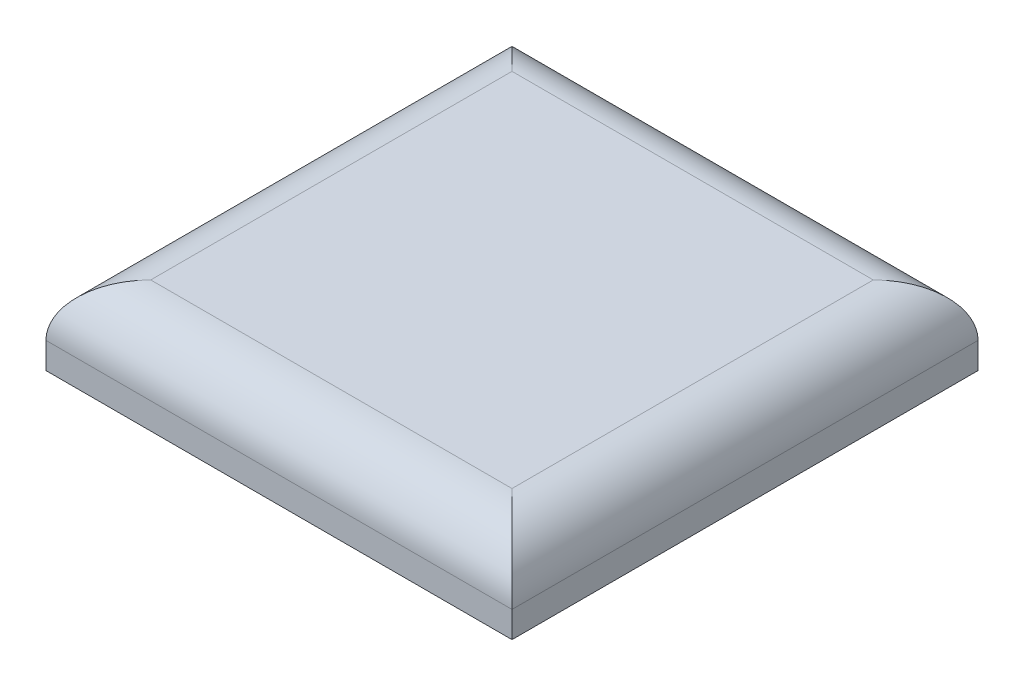
ISO-10303-21;
HEADER;
FILE_DESCRIPTION(('STEP AP214'),'2;1');
FILE_NAME('part.step','',(''),(''),'','','');
FILE_SCHEMA(('AUTOMOTIVE_DESIGN { 1 0 10303 214 1 1 1 1 }'));
ENDSEC;
DATA;
#1=APPLICATION_CONTEXT('core data for automotive mechanical design processes');
#2=APPLICATION_PROTOCOL_DEFINITION('international standard','automotive_design',2000,#1);
#3=PRODUCT_CONTEXT('',#1,'mechanical');
#4=PRODUCT('Part','Part','',(#3));
#5=PRODUCT_RELATED_PRODUCT_CATEGORY('part','',(#4));
#6=PRODUCT_DEFINITION_FORMATION('','',#4);
#7=PRODUCT_DEFINITION_CONTEXT('part definition',#1,'design');
#8=PRODUCT_DEFINITION('design','',#6,#7);
#9=PRODUCT_DEFINITION_SHAPE('','',#8);
#10=(LENGTH_UNIT() NAMED_UNIT(*) SI_UNIT(.MILLI.,.METRE.));
#11=(NAMED_UNIT(*) PLANE_ANGLE_UNIT() SI_UNIT($,.RADIAN.));
#12=(NAMED_UNIT(*) SI_UNIT($,.STERADIAN.) SOLID_ANGLE_UNIT());
#13=UNCERTAINTY_MEASURE_WITH_UNIT(LENGTH_MEASURE(1.E-05),#10,'distance_accuracy_value','');
#14=(GEOMETRIC_REPRESENTATION_CONTEXT(3) GLOBAL_UNCERTAINTY_ASSIGNED_CONTEXT((#13)) GLOBAL_UNIT_ASSIGNED_CONTEXT((#10,
#11,#12)) REPRESENTATION_CONTEXT('',''));
#15=CARTESIAN_POINT('',(0.,0.,0.));
#16=DIRECTION('',(0.,0.,1.));
#17=DIRECTION('',(1.,0.,0.));
#18=AXIS2_PLACEMENT_3D('',#15,#16,#17);
#19=CARTESIAN_POINT('',(0.,1.,-6.9));
#20=DIRECTION('',(-1.,0.,0.));
#21=DIRECTION('',(0.,0.,1.));
#22=AXIS2_PLACEMENT_3D('',#19,#20,#21);
#23=CYLINDRICAL_SURFACE('',#22,2.);
#24=CARTESIAN_POINT('',(-6.9,1.,-6.9));
#25=DIRECTION('',(-0.707106781186547,0.,0.707106781186547));
#26=DIRECTION('',(0.707106781186547,0.,0.707106781186547));
#27=AXIS2_PLACEMENT_3D('',#24,#25,#26);
#28=ELLIPSE('',#27,2.82842712474619,2.);
#29=CARTESIAN_POINT('',(-6.9,3.,-6.9));
#30=VERTEX_POINT('',#29);
#31=CARTESIAN_POINT('',(-8.9,1.,-8.9));
#32=VERTEX_POINT('',#31);
#33=EDGE_CURVE('E11',#30,#32,#28,.T.);
#34=ORIENTED_EDGE('',*,*,#33,.F.);
#35=DIRECTION('',(-1.,0.,0.));
#36=VECTOR('',#35,1.);
#37=CARTESIAN_POINT('',(0.,3.,-6.9));
#38=LINE('',#37,#36);
#39=CARTESIAN_POINT('',(6.9,3.,-6.9));
#40=VERTEX_POINT('',#39);
#41=EDGE_CURVE('E96',#40,#30,#38,.T.);
#42=ORIENTED_EDGE('',*,*,#41,.F.);
#43=CARTESIAN_POINT('',(6.9,1.,-6.9));
#44=DIRECTION('',(-0.707106781186547,0.,-0.707106781186547));
#45=DIRECTION('',(-0.707106781186547,0.,0.707106781186547));
#46=AXIS2_PLACEMENT_3D('',#43,#44,#45);
#47=ELLIPSE('',#46,2.82842712474619,2.);
#48=CARTESIAN_POINT('',(8.9,1.,-8.9));
#49=VERTEX_POINT('',#48);
#50=EDGE_CURVE('E42',#40,#49,#47,.T.);
#51=ORIENTED_EDGE('',*,*,#50,.T.);
#52=DIRECTION('',(-1.,0.,0.));
#53=VECTOR('',#52,1.);
#54=CARTESIAN_POINT('',(-8.9,1.,-8.9));
#55=LINE('',#54,#53);
#56=EDGE_CURVE('E93',#32,#49,#55,.F.);
#57=ORIENTED_EDGE('',*,*,#56,.F.);
#58=EDGE_LOOP('',(#34,#42,#51,#57));
#59=FACE_BOUND('',#58,.T.);
#60=ADVANCED_FACE('F35',(#59),#23,.T.);
#61=CARTESIAN_POINT('',(6.9,1.,0.));
#62=DIRECTION('',(0.,0.,-1.));
#63=DIRECTION('',(-1.,0.,0.));
#64=AXIS2_PLACEMENT_3D('',#61,#62,#63);
#65=CYLINDRICAL_SURFACE('',#64,2.);
#66=ORIENTED_EDGE('',*,*,#50,.F.);
#67=DIRECTION('',(0.,0.,-1.));
#68=VECTOR('',#67,1.);
#69=CARTESIAN_POINT('',(6.9,3.,0.));
#70=LINE('',#69,#68);
#71=CARTESIAN_POINT('',(6.9,3.,6.9));
#72=VERTEX_POINT('',#71);
#73=EDGE_CURVE('E122',#72,#40,#70,.T.);
#74=ORIENTED_EDGE('',*,*,#73,.F.);
#75=CARTESIAN_POINT('',(6.9,1.,6.9));
#76=DIRECTION('',(0.707106781186547,0.,-0.707106781186547));
#77=DIRECTION('',(-0.707106781186547,0.,-0.707106781186547));
#78=AXIS2_PLACEMENT_3D('',#75,#76,#77);
#79=ELLIPSE('',#78,2.82842712474619,2.);
#80=CARTESIAN_POINT('',(8.9,1.,8.9));
#81=VERTEX_POINT('',#80);
#82=EDGE_CURVE('E56',#72,#81,#79,.T.);
#83=ORIENTED_EDGE('',*,*,#82,.T.);
#84=DIRECTION('',(0.,0.,-1.));
#85=VECTOR('',#84,1.);
#86=CARTESIAN_POINT('',(8.9,1.,8.9));
#87=LINE('',#86,#85);
#88=EDGE_CURVE('E137',#49,#81,#87,.F.);
#89=ORIENTED_EDGE('',*,*,#88,.F.);
#90=EDGE_LOOP('',(#66,#74,#83,#89));
#91=FACE_BOUND('',#90,.T.);
#92=ADVANCED_FACE('F165',(#91),#65,.T.);
#93=CARTESIAN_POINT('',(0.,1.,6.9));
#94=DIRECTION('',(1.,0.,0.));
#95=DIRECTION('',(0.,0.,-1.));
#96=AXIS2_PLACEMENT_3D('',#93,#94,#95);
#97=CYLINDRICAL_SURFACE('',#96,2.);
#98=ORIENTED_EDGE('',*,*,#82,.F.);
#99=DIRECTION('',(1.,0.,0.));
#100=VECTOR('',#99,1.);
#101=CARTESIAN_POINT('',(0.,3.,6.9));
#102=LINE('',#101,#100);
#103=CARTESIAN_POINT('',(-6.9,3.,6.9));
#104=VERTEX_POINT('',#103);
#105=EDGE_CURVE('E125',#104,#72,#102,.T.);
#106=ORIENTED_EDGE('',*,*,#105,.F.);
#107=CARTESIAN_POINT('',(-6.9,1.,6.9));
#108=DIRECTION('',(0.707106781186547,0.,0.707106781186547));
#109=DIRECTION('',(0.707106781186547,0.,-0.707106781186547));
#110=AXIS2_PLACEMENT_3D('',#107,#108,#109);
#111=ELLIPSE('',#110,2.82842712474619,2.);
#112=CARTESIAN_POINT('',(-8.9,1.,8.9));
#113=VERTEX_POINT('',#112);
#114=EDGE_CURVE('E140',#104,#113,#111,.T.);
#115=ORIENTED_EDGE('',*,*,#114,.T.);
#116=DIRECTION('',(1.,0.,0.));
#117=VECTOR('',#116,1.);
#118=CARTESIAN_POINT('',(-8.9,1.,8.9));
#119=LINE('',#118,#117);
#120=EDGE_CURVE('E134',#81,#113,#119,.F.);
#121=ORIENTED_EDGE('',*,*,#120,.F.);
#122=EDGE_LOOP('',(#98,#106,#115,#121));
#123=FACE_BOUND('',#122,.T.);
#124=ADVANCED_FACE('F145',(#123),#97,.T.);
#125=CARTESIAN_POINT('',(-6.9,1.,0.));
#126=DIRECTION('',(0.,0.,1.));
#127=DIRECTION('',(1.,0.,0.));
#128=AXIS2_PLACEMENT_3D('',#125,#126,#127);
#129=CYLINDRICAL_SURFACE('',#128,2.);
#130=DIRECTION('',(0.,0.,1.));
#131=VECTOR('',#130,1.);
#132=CARTESIAN_POINT('',(-6.9,3.,0.));
#133=LINE('',#132,#131);
#134=EDGE_CURVE('E128',#30,#104,#133,.T.);
#135=ORIENTED_EDGE('',*,*,#134,.F.);
#136=ORIENTED_EDGE('',*,*,#33,.T.);
#137=DIRECTION('',(0.,0.,1.));
#138=VECTOR('',#137,1.);
#139=CARTESIAN_POINT('',(-8.9,1.,8.9));
#140=LINE('',#139,#138);
#141=EDGE_CURVE('E131',#113,#32,#140,.F.);
#142=ORIENTED_EDGE('',*,*,#141,.F.);
#143=ORIENTED_EDGE('',*,*,#114,.F.);
#144=EDGE_LOOP('',(#135,#136,#142,#143));
#145=FACE_BOUND('',#144,.T.);
#146=ADVANCED_FACE('F152',(#145),#129,.T.);
#147=CARTESIAN_POINT('',(8.9,3.,8.9));
#148=DIRECTION('',(-1.,0.,0.));
#149=DIRECTION('',(0.,0.,1.));
#150=AXIS2_PLACEMENT_3D('',#147,#148,#149);
#151=PLANE('',#150);
#152=DIRECTION('',(0.,-1.,0.));
#153=VECTOR('',#152,1.);
#154=CARTESIAN_POINT('',(8.9,3.,-8.9));
#155=LINE('',#154,#153);
#156=CARTESIAN_POINT('',(8.9,0.,-8.9));
#157=VERTEX_POINT('',#156);
#158=EDGE_CURVE('E87',#49,#157,#155,.T.);
#159=ORIENTED_EDGE('',*,*,#158,.F.);
#160=ORIENTED_EDGE('',*,*,#88,.T.);
#161=DIRECTION('',(0.,-1.,0.));
#162=VECTOR('',#161,1.);
#163=CARTESIAN_POINT('',(8.9,3.,8.9));
#164=LINE('',#163,#162);
#165=CARTESIAN_POINT('',(8.9,0.,8.9));
#166=VERTEX_POINT('',#165);
#167=EDGE_CURVE('E109',#81,#166,#164,.T.);
#168=ORIENTED_EDGE('',*,*,#167,.T.);
#169=DIRECTION('',(0.,0.,-1.));
#170=VECTOR('',#169,1.);
#171=CARTESIAN_POINT('',(8.9,0.,8.9));
#172=LINE('',#171,#170);
#173=EDGE_CURVE('E103',#166,#157,#172,.T.);
#174=ORIENTED_EDGE('',*,*,#173,.T.);
#175=EDGE_LOOP('',(#159,#160,#168,#174));
#176=FACE_BOUND('',#175,.T.);
#177=ADVANCED_FACE('F107',(#176),#151,.F.);
#178=CARTESIAN_POINT('',(-8.9,3.,-8.9));
#179=DIRECTION('',(0.,0.,1.));
#180=DIRECTION('',(1.,0.,0.));
#181=AXIS2_PLACEMENT_3D('',#178,#179,#180);
#182=PLANE('',#181);
#183=DIRECTION('',(0.,-1.,0.));
#184=VECTOR('',#183,1.);
#185=CARTESIAN_POINT('',(-8.9,3.,-8.9));
#186=LINE('',#185,#184);
#187=CARTESIAN_POINT('',(-8.9,0.,-8.9));
#188=VERTEX_POINT('',#187);
#189=EDGE_CURVE('E97',#32,#188,#186,.T.);
#190=ORIENTED_EDGE('',*,*,#189,.F.);
#191=ORIENTED_EDGE('',*,*,#56,.T.);
#192=ORIENTED_EDGE('',*,*,#158,.T.);
#193=DIRECTION('',(-1.,0.,0.));
#194=VECTOR('',#193,1.);
#195=CARTESIAN_POINT('',(-8.9,0.,-8.9));
#196=LINE('',#195,#194);
#197=EDGE_CURVE('E91',#157,#188,#196,.T.);
#198=ORIENTED_EDGE('',*,*,#197,.T.);
#199=EDGE_LOOP('',(#190,#191,#192,#198));
#200=FACE_BOUND('',#199,.T.);
#201=ADVANCED_FACE('F90',(#200),#182,.F.);
#202=CARTESIAN_POINT('',(-8.9,3.,8.9));
#203=DIRECTION('',(1.,0.,0.));
#204=DIRECTION('',(0.,0.,-1.));
#205=AXIS2_PLACEMENT_3D('',#202,#203,#204);
#206=PLANE('',#205);
#207=DIRECTION('',(0.,-1.,0.));
#208=VECTOR('',#207,1.);
#209=CARTESIAN_POINT('',(-8.9,3.,8.9));
#210=LINE('',#209,#208);
#211=CARTESIAN_POINT('',(-8.9,0.,8.9));
#212=VERTEX_POINT('',#211);
#213=EDGE_CURVE('E117',#113,#212,#210,.T.);
#214=ORIENTED_EDGE('',*,*,#213,.F.);
#215=ORIENTED_EDGE('',*,*,#141,.T.);
#216=ORIENTED_EDGE('',*,*,#189,.T.);
#217=DIRECTION('',(0.,0.,1.));
#218=VECTOR('',#217,1.);
#219=CARTESIAN_POINT('',(-8.9,0.,8.9));
#220=LINE('',#219,#218);
#221=EDGE_CURVE('E105',#188,#212,#220,.T.);
#222=ORIENTED_EDGE('',*,*,#221,.T.);
#223=EDGE_LOOP('',(#214,#215,#216,#222));
#224=FACE_BOUND('',#223,.T.);
#225=ADVANCED_FACE('F154',(#224),#206,.F.);
#226=CARTESIAN_POINT('',(-8.9,3.,8.9));
#227=DIRECTION('',(0.,0.,-1.));
#228=DIRECTION('',(-1.,0.,0.));
#229=AXIS2_PLACEMENT_3D('',#226,#227,#228);
#230=PLANE('',#229);
#231=ORIENTED_EDGE('',*,*,#167,.F.);
#232=ORIENTED_EDGE('',*,*,#120,.T.);
#233=ORIENTED_EDGE('',*,*,#213,.T.);
#234=DIRECTION('',(1.,0.,0.));
#235=VECTOR('',#234,1.);
#236=CARTESIAN_POINT('',(-8.9,0.,8.9));
#237=LINE('',#236,#235);
#238=EDGE_CURVE('E114',#212,#166,#237,.T.);
#239=ORIENTED_EDGE('',*,*,#238,.T.);
#240=EDGE_LOOP('',(#231,#232,#233,#239));
#241=FACE_BOUND('',#240,.T.);
#242=ADVANCED_FACE('F150',(#241),#230,.F.);
#243=CARTESIAN_POINT('',(0.,3.,0.));
#244=DIRECTION('',(0.,-1.,0.));
#245=DIRECTION('',(0.,0.,-1.));
#246=AXIS2_PLACEMENT_3D('',#243,#244,#245);
#247=PLANE('',#246);
#248=ORIENTED_EDGE('',*,*,#41,.T.);
#249=ORIENTED_EDGE('',*,*,#134,.T.);
#250=ORIENTED_EDGE('',*,*,#105,.T.);
#251=ORIENTED_EDGE('',*,*,#73,.T.);
#252=EDGE_LOOP('',(#248,#249,#250,#251));
#253=FACE_BOUND('',#252,.T.);
#254=ADVANCED_FACE('F161',(#253),#247,.F.);
#255=CARTESIAN_POINT('',(0.,0.,0.));
#256=DIRECTION('',(0.,-1.,0.));
#257=DIRECTION('',(0.,0.,-1.));
#258=AXIS2_PLACEMENT_3D('',#255,#256,#257);
#259=PLANE('',#258);
#260=ORIENTED_EDGE('',*,*,#173,.F.);
#261=ORIENTED_EDGE('',*,*,#238,.F.);
#262=ORIENTED_EDGE('',*,*,#221,.F.);
#263=ORIENTED_EDGE('',*,*,#197,.F.);
#264=EDGE_LOOP('',(#260,#261,#262,#263));
#265=FACE_BOUND('',#264,.T.);
#266=ADVANCED_FACE('F101',(#265),#259,.T.);
#267=CLOSED_SHELL('',(#60,#92,#124,#146,#177,#201,#225,#242,#254,#266));
#268=MANIFOLD_SOLID_BREP('B2',#267);
#269=ADVANCED_BREP_SHAPE_REPRESENTATION('',(#18,#268),#14);
#270=SHAPE_DEFINITION_REPRESENTATION(#9,#269);
ENDSEC;
END-ISO-10303-21;
